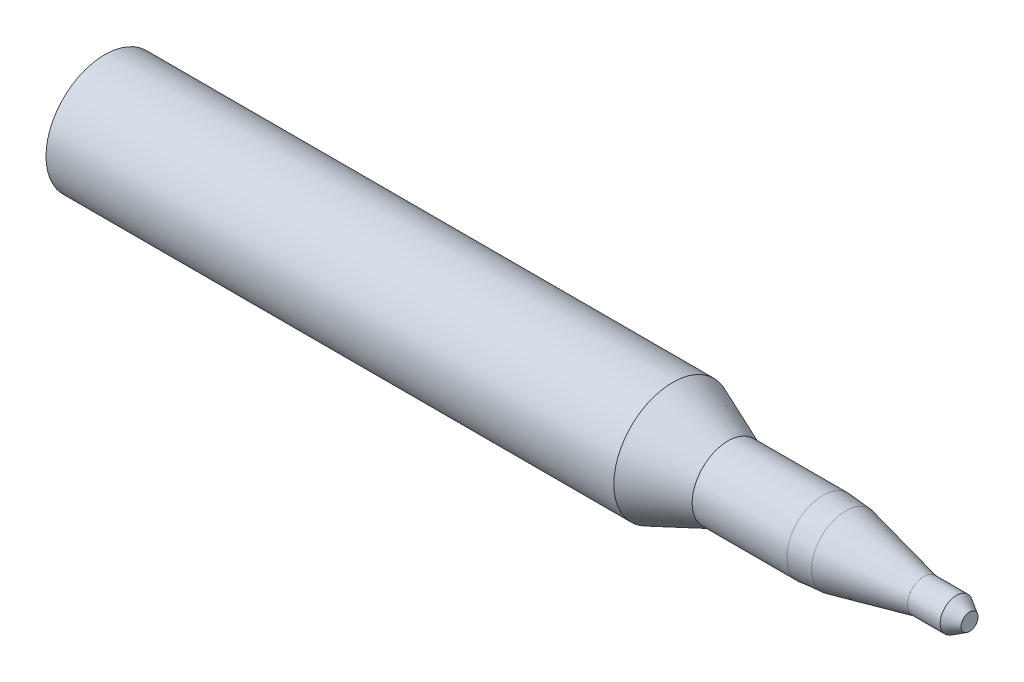
ISO-10303-21;
HEADER;
FILE_DESCRIPTION(('STEP AP214'),'2;1');
FILE_NAME('part.step','',(''),(''),'','','');
FILE_SCHEMA(('AUTOMOTIVE_DESIGN { 1 0 10303 214 1 1 1 1 }'));
ENDSEC;
DATA;
#1=APPLICATION_CONTEXT('core data for automotive mechanical design processes');
#2=APPLICATION_PROTOCOL_DEFINITION('international standard','automotive_design',2000,#1);
#3=PRODUCT_CONTEXT('',#1,'mechanical');
#4=PRODUCT('Part','Part','',(#3));
#5=PRODUCT_RELATED_PRODUCT_CATEGORY('part','',(#4));
#6=PRODUCT_DEFINITION_FORMATION('','',#4);
#7=PRODUCT_DEFINITION_CONTEXT('part definition',#1,'design');
#8=PRODUCT_DEFINITION('design','',#6,#7);
#9=PRODUCT_DEFINITION_SHAPE('','',#8);
#10=(LENGTH_UNIT() NAMED_UNIT(*) SI_UNIT(.MILLI.,.METRE.));
#11=(NAMED_UNIT(*) PLANE_ANGLE_UNIT() SI_UNIT($,.RADIAN.));
#12=(NAMED_UNIT(*) SI_UNIT($,.STERADIAN.) SOLID_ANGLE_UNIT());
#13=UNCERTAINTY_MEASURE_WITH_UNIT(LENGTH_MEASURE(1.E-05),#10,'distance_accuracy_value','');
#14=(GEOMETRIC_REPRESENTATION_CONTEXT(3) GLOBAL_UNCERTAINTY_ASSIGNED_CONTEXT((#13)) GLOBAL_UNIT_ASSIGNED_CONTEXT((#10,
#11,#12)) REPRESENTATION_CONTEXT('',''));
#15=CARTESIAN_POINT('',(0.,0.,0.));
#16=DIRECTION('',(0.,0.,1.));
#17=DIRECTION('',(1.,0.,0.));
#18=AXIS2_PLACEMENT_3D('',#15,#16,#17);
#19=CARTESIAN_POINT('',(0.,90.,0.));
#20=DIRECTION('',(1.,0.,0.));
#21=DIRECTION('',(0.,0.,-1.));
#22=AXIS2_PLACEMENT_3D('',#19,#20,#21);
#23=PLANE('',#22);
#24=CARTESIAN_POINT('',(0.,0.,0.));
#25=DIRECTION('',(-1.,0.,0.));
#26=DIRECTION('',(0.,0.,1.));
#27=AXIS2_PLACEMENT_3D('',#24,#25,#26);
#28=CIRCLE('',#27,90.);
#29=CARTESIAN_POINT('',(0.,0.,90.));
#30=VERTEX_POINT('',#29);
#31=EDGE_CURVE('E78',#30,#30,#28,.T.);
#32=ORIENTED_EDGE('',*,*,#31,.T.);
#33=EDGE_LOOP('',(#32));
#34=FACE_BOUND('',#33,.T.);
#35=ADVANCED_FACE('F43',(#34),#23,.F.);
#36=CARTESIAN_POINT('',(1325.,0.,0.));
#37=DIRECTION('',(-1.,0.,0.));
#38=DIRECTION('',(0.,0.,1.));
#39=AXIS2_PLACEMENT_3D('',#36,#37,#38);
#40=PLANE('',#39);
#41=CARTESIAN_POINT('',(1325.,0.,0.));
#42=DIRECTION('',(-1.,0.,0.));
#43=DIRECTION('',(0.,0.,1.));
#44=AXIS2_PLACEMENT_3D('',#41,#42,#43);
#45=CIRCLE('',#44,13.);
#46=CARTESIAN_POINT('',(1325.,0.,13.));
#47=VERTEX_POINT('',#46);
#48=EDGE_CURVE('E10',#47,#47,#45,.T.);
#49=ORIENTED_EDGE('',*,*,#48,.F.);
#50=EDGE_LOOP('',(#49));
#51=FACE_BOUND('',#50,.T.);
#52=ADVANCED_FACE('F121',(#51),#40,.F.);
#53=CARTESIAN_POINT('',(1325.,0.,0.));
#54=DIRECTION('',(-1.,0.,0.));
#55=DIRECTION('',(0.,0.,1.));
#56=AXIS2_PLACEMENT_3D('',#53,#54,#55);
#57=CONICAL_SURFACE('',#56,13.,0.540419500270584);
#58=CARTESIAN_POINT('',(1305.,0.,0.));
#59=DIRECTION('',(-1.,0.,0.));
#60=DIRECTION('',(0.,0.,1.));
#61=AXIS2_PLACEMENT_3D('',#58,#59,#60);
#62=CIRCLE('',#61,25.);
#63=CARTESIAN_POINT('',(1305.,0.,25.));
#64=VERTEX_POINT('',#63);
#65=EDGE_CURVE('E50',#64,#64,#62,.T.);
#66=ORIENTED_EDGE('',*,*,#65,.F.);
#67=EDGE_LOOP('',(#66));
#68=FACE_BOUND('',#67,.T.);
#69=ORIENTED_EDGE('',*,*,#48,.T.);
#70=EDGE_LOOP('',(#69));
#71=FACE_BOUND('',#70,.T.);
#72=ADVANCED_FACE('F116',(#68,#71),#57,.T.);
#73=CARTESIAN_POINT('',(0.,0.,0.));
#74=DIRECTION('',(-1.,0.,0.));
#75=DIRECTION('',(0.,0.,1.));
#76=AXIS2_PLACEMENT_3D('',#73,#74,#75);
#77=CYLINDRICAL_SURFACE('',#76,25.);
#78=CARTESIAN_POINT('',(1255.,0.,0.));
#79=DIRECTION('',(-1.,0.,0.));
#80=DIRECTION('',(0.,0.,1.));
#81=AXIS2_PLACEMENT_3D('',#78,#79,#80);
#82=CIRCLE('',#81,25.);
#83=CARTESIAN_POINT('',(1255.,0.,25.));
#84=VERTEX_POINT('',#83);
#85=EDGE_CURVE('E55',#84,#84,#82,.T.);
#86=ORIENTED_EDGE('',*,*,#85,.F.);
#87=EDGE_LOOP('',(#86));
#88=FACE_BOUND('',#87,.T.);
#89=ORIENTED_EDGE('',*,*,#65,.T.);
#90=EDGE_LOOP('',(#89));
#91=FACE_BOUND('',#90,.T.);
#92=ADVANCED_FACE('F111',(#88,#91),#77,.T.);
#93=CARTESIAN_POINT('',(1255.,0.,0.));
#94=DIRECTION('',(-1.,0.,0.));
#95=DIRECTION('',(0.,0.,1.));
#96=AXIS2_PLACEMENT_3D('',#93,#94,#95);
#97=CONICAL_SURFACE('',#96,25.,0.221819620111433);
#98=CARTESIAN_POINT('',(1135.,0.,0.));
#99=DIRECTION('',(-1.,0.,0.));
#100=DIRECTION('',(0.,0.,1.));
#101=AXIS2_PLACEMENT_3D('',#98,#99,#100);
#102=CIRCLE('',#101,52.0636975321496);
#103=CARTESIAN_POINT('',(1135.,0.,52.0636975321496));
#104=VERTEX_POINT('',#103);
#105=EDGE_CURVE('E60',#104,#104,#102,.T.);
#106=ORIENTED_EDGE('',*,*,#105,.F.);
#107=EDGE_LOOP('',(#106));
#108=FACE_BOUND('',#107,.T.);
#109=ORIENTED_EDGE('',*,*,#85,.T.);
#110=EDGE_LOOP('',(#109));
#111=FACE_BOUND('',#110,.T.);
#112=ADVANCED_FACE('F105',(#108,#111),#97,.T.);
#113=CARTESIAN_POINT('',(1135.,0.,0.));
#114=DIRECTION('',(-1.,0.,0.));
#115=DIRECTION('',(0.,0.,1.));
#116=AXIS2_PLACEMENT_3D('',#113,#114,#115);
#117=CONICAL_SURFACE('',#116,52.0636975321496,0.0836983597312194);
#118=CARTESIAN_POINT('',(1100.,0.,0.));
#119=DIRECTION('',(-1.,0.,0.));
#120=DIRECTION('',(0.,0.,1.));
#121=AXIS2_PLACEMENT_3D('',#118,#119,#120);
#122=CIRCLE('',#121,55.);
#123=CARTESIAN_POINT('',(1100.,0.,55.));
#124=VERTEX_POINT('',#123);
#125=EDGE_CURVE('E66',#124,#124,#122,.T.);
#126=ORIENTED_EDGE('',*,*,#125,.F.);
#127=EDGE_LOOP('',(#126));
#128=FACE_BOUND('',#127,.T.);
#129=ORIENTED_EDGE('',*,*,#105,.T.);
#130=EDGE_LOOP('',(#129));
#131=FACE_BOUND('',#130,.T.);
#132=ADVANCED_FACE('F99',(#128,#131),#117,.T.);
#133=CARTESIAN_POINT('',(0.,0.,0.));
#134=DIRECTION('',(-1.,0.,0.));
#135=DIRECTION('',(0.,0.,1.));
#136=AXIS2_PLACEMENT_3D('',#133,#134,#135);
#137=CYLINDRICAL_SURFACE('',#136,55.);
#138=CARTESIAN_POINT('',(955.,0.,0.));
#139=DIRECTION('',(-1.,0.,0.));
#140=DIRECTION('',(0.,0.,1.));
#141=AXIS2_PLACEMENT_3D('',#138,#139,#140);
#142=CIRCLE('',#141,55.);
#143=CARTESIAN_POINT('',(955.,0.,55.));
#144=VERTEX_POINT('',#143);
#145=EDGE_CURVE('E70',#144,#144,#142,.T.);
#146=ORIENTED_EDGE('',*,*,#145,.F.);
#147=EDGE_LOOP('',(#146));
#148=FACE_BOUND('',#147,.T.);
#149=ORIENTED_EDGE('',*,*,#125,.T.);
#150=EDGE_LOOP('',(#149));
#151=FACE_BOUND('',#150,.T.);
#152=ADVANCED_FACE('F93',(#148,#151),#137,.T.);
#153=CARTESIAN_POINT('',(955.,0.,0.));
#154=DIRECTION('',(-1.,0.,0.));
#155=DIRECTION('',(0.,0.,1.));
#156=AXIS2_PLACEMENT_3D('',#153,#154,#155);
#157=CONICAL_SURFACE('',#156,55.,0.390607043697688);
#158=CARTESIAN_POINT('',(870.,0.,0.));
#159=DIRECTION('',(-1.,0.,0.));
#160=DIRECTION('',(0.,0.,1.));
#161=AXIS2_PLACEMENT_3D('',#158,#159,#160);
#162=CIRCLE('',#161,90.0000000000001);
#163=CARTESIAN_POINT('',(870.,0.,90.0000000000001));
#164=VERTEX_POINT('',#163);
#165=EDGE_CURVE('E74',#164,#164,#162,.T.);
#166=ORIENTED_EDGE('',*,*,#165,.F.);
#167=EDGE_LOOP('',(#166));
#168=FACE_BOUND('',#167,.T.);
#169=ORIENTED_EDGE('',*,*,#145,.T.);
#170=EDGE_LOOP('',(#169));
#171=FACE_BOUND('',#170,.T.);
#172=ADVANCED_FACE('F87',(#168,#171),#157,.T.);
#173=CARTESIAN_POINT('',(0.,0.,0.));
#174=DIRECTION('',(-1.,0.,0.));
#175=DIRECTION('',(0.,0.,1.));
#176=AXIS2_PLACEMENT_3D('',#173,#174,#175);
#177=CYLINDRICAL_SURFACE('',#176,90.0000000000001);
#178=ORIENTED_EDGE('',*,*,#31,.F.);
#179=EDGE_LOOP('',(#178));
#180=FACE_BOUND('',#179,.T.);
#181=ORIENTED_EDGE('',*,*,#165,.T.);
#182=EDGE_LOOP('',(#181));
#183=FACE_BOUND('',#182,.T.);
#184=ADVANCED_FACE('F84',(#180,#183),#177,.T.);
#185=CLOSED_SHELL('',(#35,#52,#72,#92,#112,#132,#152,#172,#184));
#186=MANIFOLD_SOLID_BREP('B2',#185);
#187=ADVANCED_BREP_SHAPE_REPRESENTATION('',(#18,#186),#14);
#188=SHAPE_DEFINITION_REPRESENTATION(#9,#187);
ENDSEC;
END-ISO-10303-21;
